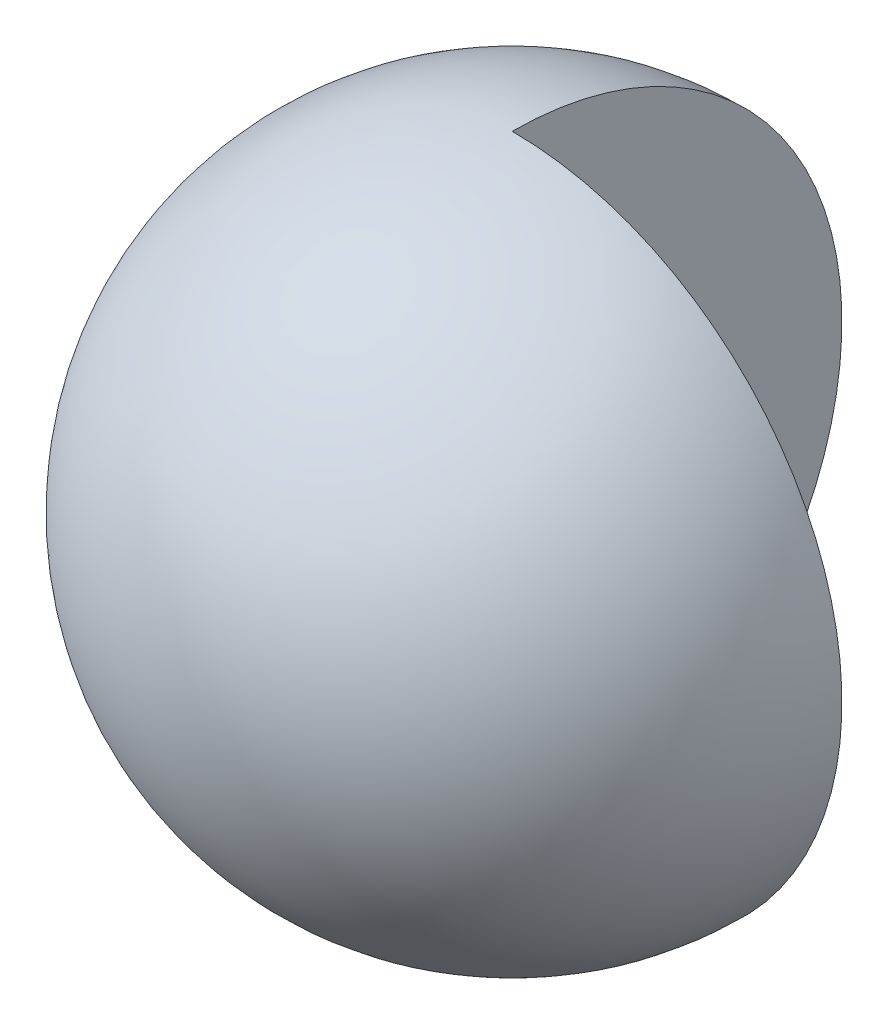
ISO-10303-21;
HEADER;
FILE_DESCRIPTION(('STEP AP214'),'2;1');
FILE_NAME('part.step','',(''),(''),'','','');
FILE_SCHEMA(('AUTOMOTIVE_DESIGN { 1 0 10303 214 1 1 1 1 }'));
ENDSEC;
DATA;
#1=APPLICATION_CONTEXT('core data for automotive mechanical design processes');
#2=APPLICATION_PROTOCOL_DEFINITION('international standard','automotive_design',2000,#1);
#3=PRODUCT_CONTEXT('',#1,'mechanical');
#4=PRODUCT('Part','Part','',(#3));
#5=PRODUCT_RELATED_PRODUCT_CATEGORY('part','',(#4));
#6=PRODUCT_DEFINITION_FORMATION('','',#4);
#7=PRODUCT_DEFINITION_CONTEXT('part definition',#1,'design');
#8=PRODUCT_DEFINITION('design','',#6,#7);
#9=PRODUCT_DEFINITION_SHAPE('','',#8);
#10=(LENGTH_UNIT() NAMED_UNIT(*) SI_UNIT(.MILLI.,.METRE.));
#11=(NAMED_UNIT(*) PLANE_ANGLE_UNIT() SI_UNIT($,.RADIAN.));
#12=(NAMED_UNIT(*) SI_UNIT($,.STERADIAN.) SOLID_ANGLE_UNIT());
#13=UNCERTAINTY_MEASURE_WITH_UNIT(LENGTH_MEASURE(1.E-05),#10,'distance_accuracy_value','');
#14=(GEOMETRIC_REPRESENTATION_CONTEXT(3) GLOBAL_UNCERTAINTY_ASSIGNED_CONTEXT((#13)) GLOBAL_UNIT_ASSIGNED_CONTEXT((#10,
#11,#12)) REPRESENTATION_CONTEXT('',''));
#15=CARTESIAN_POINT('',(0.,0.,0.));
#16=DIRECTION('',(0.,0.,1.));
#17=DIRECTION('',(1.,0.,0.));
#18=AXIS2_PLACEMENT_3D('',#15,#16,#17);
#19=CARTESIAN_POINT('',(0.,0.,0.));
#20=DIRECTION('',(0.,1.,0.));
#21=DIRECTION('',(0.,0.,-1.));
#22=AXIS2_PLACEMENT_3D('',#19,#20,#21);
#23=SPHERICAL_SURFACE('',#22,29.8543510514883);
#24=CARTESIAN_POINT('',(0.,0.,0.));
#25=DIRECTION('',(0.,0.,1.));
#26=DIRECTION('',(1.,0.,0.));
#27=AXIS2_PLACEMENT_3D('',#24,#25,#26);
#28=CIRCLE('',#27,29.8543510514883);
#29=CARTESIAN_POINT('',(0.,-29.8543510514883,0.));
#30=VERTEX_POINT('',#29);
#31=CARTESIAN_POINT('',(0.,29.8543510514883,0.));
#32=VERTEX_POINT('',#31);
#33=EDGE_CURVE('E46',#30,#32,#28,.T.);
#34=ORIENTED_EDGE('',*,*,#33,.T.);
#35=CARTESIAN_POINT('',(0.,0.,0.));
#36=DIRECTION('',(1.,0.,0.));
#37=DIRECTION('',(0.,0.,-1.));
#38=AXIS2_PLACEMENT_3D('',#35,#36,#37);
#39=CIRCLE('',#38,29.8543510514883);
#40=EDGE_CURVE('E40',#30,#32,#39,.T.);
#41=ORIENTED_EDGE('',*,*,#40,.F.);
#42=EDGE_LOOP('',(#34,#41));
#43=FACE_BOUND('',#42,.T.);
#44=ADVANCED_FACE('F33',(#43),#23,.T.);
#45=CARTESIAN_POINT('',(0.,0.,0.));
#46=DIRECTION('',(1.,0.,0.));
#47=DIRECTION('',(0.,0.,-1.));
#48=AXIS2_PLACEMENT_3D('',#45,#46,#47);
#49=PLANE('',#48);
#50=ORIENTED_EDGE('',*,*,#40,.T.);
#51=DIRECTION('',(0.,-1.,0.));
#52=VECTOR('',#51,1.);
#53=CARTESIAN_POINT('',(0.,29.8543510514883,0.));
#54=LINE('',#53,#52);
#55=EDGE_CURVE('E11',#32,#30,#54,.T.);
#56=ORIENTED_EDGE('',*,*,#55,.T.);
#57=EDGE_LOOP('',(#50,#56));
#58=FACE_BOUND('',#57,.T.);
#59=ADVANCED_FACE('F53',(#58),#49,.T.);
#60=CARTESIAN_POINT('',(0.,0.,0.));
#61=DIRECTION('',(0.,0.,1.));
#62=DIRECTION('',(1.,0.,0.));
#63=AXIS2_PLACEMENT_3D('',#60,#61,#62);
#64=PLANE('',#63);
#65=ORIENTED_EDGE('',*,*,#33,.F.);
#66=ORIENTED_EDGE('',*,*,#55,.F.);
#67=EDGE_LOOP('',(#65,#66));
#68=FACE_BOUND('',#67,.T.);
#69=ADVANCED_FACE('F48',(#68),#64,.F.);
#70=CLOSED_SHELL('',(#44,#59,#69));
#71=MANIFOLD_SOLID_BREP('B2',#70);
#72=ADVANCED_BREP_SHAPE_REPRESENTATION('',(#18,#71),#14);
#73=SHAPE_DEFINITION_REPRESENTATION(#9,#72);
ENDSEC;
END-ISO-10303-21;
